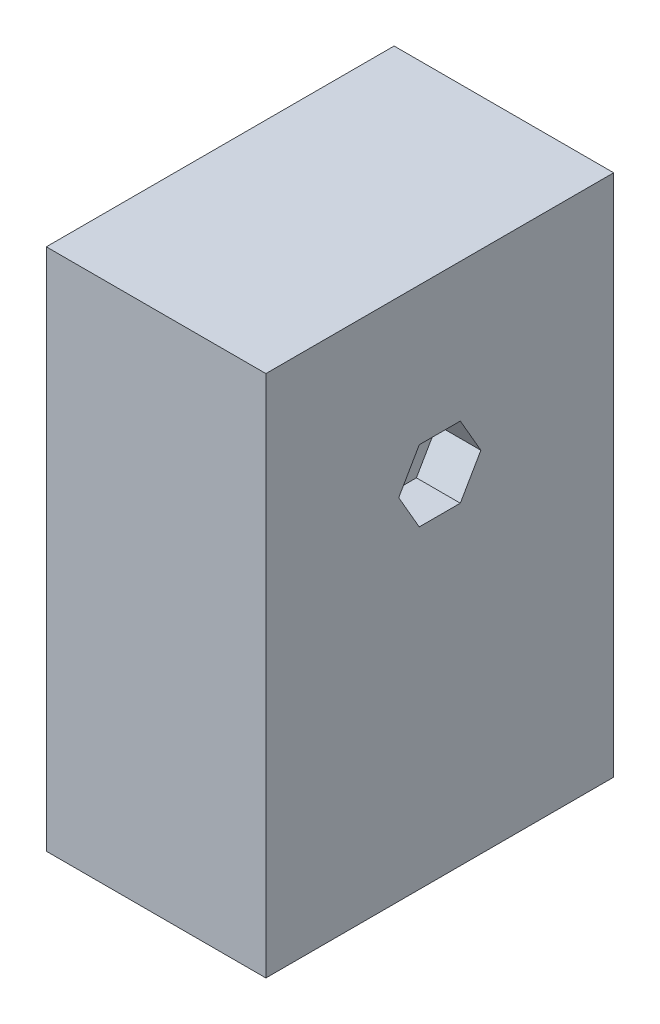
ISO-10303-21;
HEADER;
FILE_DESCRIPTION(('STEP AP214'),'2;1');
FILE_NAME('part.step','',(''),(''),'','','');
FILE_SCHEMA(('AUTOMOTIVE_DESIGN { 1 0 10303 214 1 1 1 1 }'));
ENDSEC;
DATA;
#1=APPLICATION_CONTEXT('core data for automotive mechanical design processes');
#2=APPLICATION_PROTOCOL_DEFINITION('international standard','automotive_design',2000,#1);
#3=PRODUCT_CONTEXT('',#1,'mechanical');
#4=PRODUCT('Part','Part','',(#3));
#5=PRODUCT_RELATED_PRODUCT_CATEGORY('part','',(#4));
#6=PRODUCT_DEFINITION_FORMATION('','',#4);
#7=PRODUCT_DEFINITION_CONTEXT('part definition',#1,'design');
#8=PRODUCT_DEFINITION('design','',#6,#7);
#9=PRODUCT_DEFINITION_SHAPE('','',#8);
#10=(LENGTH_UNIT() NAMED_UNIT(*) SI_UNIT(.MILLI.,.METRE.));
#11=(NAMED_UNIT(*) PLANE_ANGLE_UNIT() SI_UNIT($,.RADIAN.));
#12=(NAMED_UNIT(*) SI_UNIT($,.STERADIAN.) SOLID_ANGLE_UNIT());
#13=UNCERTAINTY_MEASURE_WITH_UNIT(LENGTH_MEASURE(1.E-05),#10,'distance_accuracy_value','');
#14=(GEOMETRIC_REPRESENTATION_CONTEXT(3) GLOBAL_UNCERTAINTY_ASSIGNED_CONTEXT((#13)) GLOBAL_UNIT_ASSIGNED_CONTEXT((#10,
#11,#12)) REPRESENTATION_CONTEXT('',''));
#15=CARTESIAN_POINT('',(0.,0.,0.));
#16=DIRECTION('',(0.,0.,1.));
#17=DIRECTION('',(1.,0.,0.));
#18=AXIS2_PLACEMENT_3D('',#15,#16,#17);
#19=CARTESIAN_POINT('',(25.,0.,0.));
#20=DIRECTION('',(1.,0.,0.));
#21=DIRECTION('',(0.,0.,-1.));
#22=AXIS2_PLACEMENT_3D('',#19,#20,#21);
#23=PLANE('',#22);
#24=DIRECTION('',(0.,1.,0.));
#25=VECTOR('',#24,1.);
#26=CARTESIAN_POINT('',(25.,29.8,-19.8));
#27=LINE('',#26,#25);
#28=CARTESIAN_POINT('',(25.,-29.8,-19.8));
#29=VERTEX_POINT('',#28);
#30=CARTESIAN_POINT('',(25.,29.8,-19.8));
#31=VERTEX_POINT('',#30);
#32=EDGE_CURVE('E252',#29,#31,#27,.T.);
#33=ORIENTED_EDGE('',*,*,#32,.T.);
#34=DIRECTION('',(0.,0.,1.));
#35=VECTOR('',#34,1.);
#36=CARTESIAN_POINT('',(25.,29.8,19.8));
#37=LINE('',#36,#35);
#38=CARTESIAN_POINT('',(25.,29.8,19.8));
#39=VERTEX_POINT('',#38);
#40=EDGE_CURVE('E256',#31,#39,#37,.T.);
#41=ORIENTED_EDGE('',*,*,#40,.T.);
#42=DIRECTION('',(0.,-1.,0.));
#43=VECTOR('',#42,1.);
#44=CARTESIAN_POINT('',(25.,29.8,19.8));
#45=LINE('',#44,#43);
#46=CARTESIAN_POINT('',(25.,-29.8,19.8));
#47=VERTEX_POINT('',#46);
#48=EDGE_CURVE('E260',#39,#47,#45,.T.);
#49=ORIENTED_EDGE('',*,*,#48,.T.);
#50=DIRECTION('',(0.,0.,-1.));
#51=VECTOR('',#50,1.);
#52=CARTESIAN_POINT('',(25.,-29.8,19.8));
#53=LINE('',#52,#51);
#54=EDGE_CURVE('E263',#47,#29,#53,.T.);
#55=ORIENTED_EDGE('',*,*,#54,.T.);
#56=EDGE_LOOP('',(#33,#41,#49,#55));
#57=FACE_BOUND('',#56,.T.);
#58=DIRECTION('',(0.,0.,1.));
#59=VECTOR('',#58,1.);
#60=CARTESIAN_POINT('',(25.,5.95,0.));
#61=LINE('',#60,#59);
#62=CARTESIAN_POINT('',(25.,5.95,-2.33826859021799));
#63=VERTEX_POINT('',#62);
#64=CARTESIAN_POINT('',(25.,5.95,2.33826859021799));
#65=VERTEX_POINT('',#64);
#66=EDGE_CURVE('E176',#63,#65,#61,.T.);
#67=ORIENTED_EDGE('',*,*,#66,.T.);
#68=DIRECTION('',(0.,0.866025403784439,0.5));
#69=VECTOR('',#68,1.);
#70=CARTESIAN_POINT('',(25.,0.474999999999998,-0.822724133595214));
#71=LINE('',#70,#69);
#72=CARTESIAN_POINT('',(25.,10.,4.67653718043597));
#73=VERTEX_POINT('',#72);
#74=EDGE_CURVE('E57',#65,#73,#71,.T.);
#75=ORIENTED_EDGE('',*,*,#74,.T.);
#76=DIRECTION('',(0.,0.866025403784439,-0.5));
#77=VECTOR('',#76,1.);
#78=CARTESIAN_POINT('',(25.,4.525,7.83752990424917));
#79=LINE('',#78,#77);
#80=CARTESIAN_POINT('',(25.,14.05,2.33826859021798));
#81=VERTEX_POINT('',#80);
#82=EDGE_CURVE('E180',#73,#81,#79,.T.);
#83=ORIENTED_EDGE('',*,*,#82,.T.);
#84=DIRECTION('',(0.,0.,-1.));
#85=VECTOR('',#84,1.);
#86=CARTESIAN_POINT('',(25.,14.05,0.));
#87=LINE('',#86,#85);
#88=CARTESIAN_POINT('',(25.,14.05,-2.33826859021799));
#89=VERTEX_POINT('',#88);
#90=EDGE_CURVE('E530',#81,#89,#87,.T.);
#91=ORIENTED_EDGE('',*,*,#90,.T.);
#92=DIRECTION('',(0.,-0.866025403784439,-0.5));
#93=VECTOR('',#92,1.);
#94=CARTESIAN_POINT('',(25.,4.525,-7.83752990424917));
#95=LINE('',#94,#93);
#96=CARTESIAN_POINT('',(25.,10.,-4.67653718043598));
#97=VERTEX_POINT('',#96);
#98=EDGE_CURVE('E525',#89,#97,#95,.T.);
#99=ORIENTED_EDGE('',*,*,#98,.T.);
#100=DIRECTION('',(0.,-0.866025403784439,0.5));
#101=VECTOR('',#100,1.);
#102=CARTESIAN_POINT('',(25.,0.475,0.822724133595216));
#103=LINE('',#102,#101);
#104=EDGE_CURVE('E519',#97,#63,#103,.T.);
#105=ORIENTED_EDGE('',*,*,#104,.T.);
#106=EDGE_LOOP('',(#67,#75,#83,#91,#99,#105));
#107=FACE_BOUND('',#106,.T.);
#108=ADVANCED_FACE('F39',(#57,#107),#23,.T.);
#109=CARTESIAN_POINT('',(0.,0.,0.));
#110=DIRECTION('',(1.,0.,0.));
#111=DIRECTION('',(0.,0.,-1.));
#112=AXIS2_PLACEMENT_3D('',#109,#110,#111);
#113=PLANE('',#112);
#114=DIRECTION('',(0.,1.,0.));
#115=VECTOR('',#114,1.);
#116=CARTESIAN_POINT('',(0.,29.8,-19.8));
#117=LINE('',#116,#115);
#118=CARTESIAN_POINT('',(0.,-29.8,-19.8));
#119=VERTEX_POINT('',#118);
#120=CARTESIAN_POINT('',(0.,29.8,-19.8));
#121=VERTEX_POINT('',#120);
#122=EDGE_CURVE('E251',#119,#121,#117,.T.);
#123=ORIENTED_EDGE('',*,*,#122,.F.);
#124=DIRECTION('',(0.,0.,-1.));
#125=VECTOR('',#124,1.);
#126=CARTESIAN_POINT('',(0.,-29.8,19.8));
#127=LINE('',#126,#125);
#128=CARTESIAN_POINT('',(0.,-29.8,19.8));
#129=VERTEX_POINT('',#128);
#130=EDGE_CURVE('E257',#129,#119,#127,.T.);
#131=ORIENTED_EDGE('',*,*,#130,.F.);
#132=DIRECTION('',(0.,-1.,0.));
#133=VECTOR('',#132,1.);
#134=CARTESIAN_POINT('',(0.,29.8,19.8));
#135=LINE('',#134,#133);
#136=CARTESIAN_POINT('',(0.,29.8,19.8));
#137=VERTEX_POINT('',#136);
#138=EDGE_CURVE('E273',#137,#129,#135,.T.);
#139=ORIENTED_EDGE('',*,*,#138,.F.);
#140=DIRECTION('',(0.,0.,1.));
#141=VECTOR('',#140,1.);
#142=CARTESIAN_POINT('',(0.,29.8,19.8));
#143=LINE('',#142,#141);
#144=EDGE_CURVE('E270',#121,#137,#143,.T.);
#145=ORIENTED_EDGE('',*,*,#144,.F.);
#146=EDGE_LOOP('',(#123,#131,#139,#145));
#147=FACE_BOUND('',#146,.T.);
#148=DIRECTION('',(0.,0.866025403784438,-0.5));
#149=VECTOR('',#148,1.);
#150=CARTESIAN_POINT('',(0.,5.95,-2.33826859021799));
#151=LINE('',#150,#149);
#152=CARTESIAN_POINT('',(0.,5.95,-2.33826859021799));
#153=VERTEX_POINT('',#152);
#154=CARTESIAN_POINT('',(0.,10.,-4.67653718043597));
#155=VERTEX_POINT('',#154);
#156=EDGE_CURVE('E65',#153,#155,#151,.T.);
#157=ORIENTED_EDGE('',*,*,#156,.T.);
#158=DIRECTION('',(0.,0.866025403784439,0.5));
#159=VECTOR('',#158,1.);
#160=CARTESIAN_POINT('',(0.,10.,-4.67653718043597));
#161=LINE('',#160,#159);
#162=CARTESIAN_POINT('',(0.,14.05,-2.33826859021799));
#163=VERTEX_POINT('',#162);
#164=EDGE_CURVE('E215',#155,#163,#161,.T.);
#165=ORIENTED_EDGE('',*,*,#164,.T.);
#166=DIRECTION('',(0.,0.,1.));
#167=VECTOR('',#166,1.);
#168=CARTESIAN_POINT('',(0.,14.05,-2.33826859021799));
#169=LINE('',#168,#167);
#170=CARTESIAN_POINT('',(0.,14.05,2.33826859021798));
#171=VERTEX_POINT('',#170);
#172=EDGE_CURVE('E219',#163,#171,#169,.T.);
#173=ORIENTED_EDGE('',*,*,#172,.T.);
#174=DIRECTION('',(0.,-0.866025403784439,0.5));
#175=VECTOR('',#174,1.);
#176=CARTESIAN_POINT('',(0.,14.05,2.33826859021798));
#177=LINE('',#176,#175);
#178=CARTESIAN_POINT('',(0.,10.,4.67653718043597));
#179=VERTEX_POINT('',#178);
#180=EDGE_CURVE('E223',#171,#179,#177,.T.);
#181=ORIENTED_EDGE('',*,*,#180,.T.);
#182=DIRECTION('',(0.,-0.866025403784439,-0.5));
#183=VECTOR('',#182,1.);
#184=CARTESIAN_POINT('',(0.,10.,4.67653718043597));
#185=LINE('',#184,#183);
#186=CARTESIAN_POINT('',(0.,5.95,2.33826859021799));
#187=VERTEX_POINT('',#186);
#188=EDGE_CURVE('E227',#179,#187,#185,.T.);
#189=ORIENTED_EDGE('',*,*,#188,.T.);
#190=DIRECTION('',(0.,0.,-1.));
#191=VECTOR('',#190,1.);
#192=CARTESIAN_POINT('',(0.,5.95,2.33826859021799));
#193=LINE('',#192,#191);
#194=EDGE_CURVE('E197',#187,#153,#193,.T.);
#195=ORIENTED_EDGE('',*,*,#194,.T.);
#196=EDGE_LOOP('',(#157,#165,#173,#181,#189,#195));
#197=FACE_BOUND('',#196,.T.);
#198=ADVANCED_FACE('F307',(#147,#197),#113,.F.);
#199=CARTESIAN_POINT('',(25.,29.8,-19.8));
#200=DIRECTION('',(0.,0.,1.));
#201=DIRECTION('',(0.,-1.,0.));
#202=AXIS2_PLACEMENT_3D('',#199,#200,#201);
#203=PLANE('',#202);
#204=ORIENTED_EDGE('',*,*,#122,.T.);
#205=DIRECTION('',(-1.,0.,0.));
#206=VECTOR('',#205,1.);
#207=CARTESIAN_POINT('',(25.,29.8,-19.8));
#208=LINE('',#207,#206);
#209=EDGE_CURVE('E11',#31,#121,#208,.T.);
#210=ORIENTED_EDGE('',*,*,#209,.F.);
#211=ORIENTED_EDGE('',*,*,#32,.F.);
#212=DIRECTION('',(-1.,0.,0.));
#213=VECTOR('',#212,1.);
#214=CARTESIAN_POINT('',(25.,-29.8,-19.8));
#215=LINE('',#214,#213);
#216=EDGE_CURVE('E266',#29,#119,#215,.T.);
#217=ORIENTED_EDGE('',*,*,#216,.T.);
#218=EDGE_LOOP('',(#204,#210,#211,#217));
#219=FACE_BOUND('',#218,.T.);
#220=ADVANCED_FACE('F41',(#219),#203,.F.);
#221=CARTESIAN_POINT('',(25.,29.8,19.8));
#222=DIRECTION('',(0.,-1.,0.));
#223=DIRECTION('',(0.,0.,-1.));
#224=AXIS2_PLACEMENT_3D('',#221,#222,#223);
#225=PLANE('',#224);
#226=ORIENTED_EDGE('',*,*,#144,.T.);
#227=DIRECTION('',(-1.,0.,0.));
#228=VECTOR('',#227,1.);
#229=CARTESIAN_POINT('',(25.,29.8,19.8));
#230=LINE('',#229,#228);
#231=EDGE_CURVE('E49',#39,#137,#230,.T.);
#232=ORIENTED_EDGE('',*,*,#231,.F.);
#233=ORIENTED_EDGE('',*,*,#40,.F.);
#234=ORIENTED_EDGE('',*,*,#209,.T.);
#235=EDGE_LOOP('',(#226,#232,#233,#234));
#236=FACE_BOUND('',#235,.T.);
#237=ADVANCED_FACE('F326',(#236),#225,.F.);
#238=CARTESIAN_POINT('',(25.,29.8,19.8));
#239=DIRECTION('',(0.,0.,-1.));
#240=DIRECTION('',(0.,1.,0.));
#241=AXIS2_PLACEMENT_3D('',#238,#239,#240);
#242=PLANE('',#241);
#243=ORIENTED_EDGE('',*,*,#138,.T.);
#244=DIRECTION('',(-1.,0.,0.));
#245=VECTOR('',#244,1.);
#246=CARTESIAN_POINT('',(25.,-29.8,19.8));
#247=LINE('',#246,#245);
#248=EDGE_CURVE('E281',#47,#129,#247,.T.);
#249=ORIENTED_EDGE('',*,*,#248,.F.);
#250=ORIENTED_EDGE('',*,*,#48,.F.);
#251=ORIENTED_EDGE('',*,*,#231,.T.);
#252=EDGE_LOOP('',(#243,#249,#250,#251));
#253=FACE_BOUND('',#252,.T.);
#254=ADVANCED_FACE('F323',(#253),#242,.F.);
#255=CARTESIAN_POINT('',(25.,-29.8,19.8));
#256=DIRECTION('',(0.,1.,0.));
#257=DIRECTION('',(0.,0.,1.));
#258=AXIS2_PLACEMENT_3D('',#255,#256,#257);
#259=PLANE('',#258);
#260=ORIENTED_EDGE('',*,*,#130,.T.);
#261=ORIENTED_EDGE('',*,*,#216,.F.);
#262=ORIENTED_EDGE('',*,*,#54,.F.);
#263=ORIENTED_EDGE('',*,*,#248,.T.);
#264=EDGE_LOOP('',(#260,#261,#262,#263));
#265=FACE_BOUND('',#264,.T.);
#266=ADVANCED_FACE('F320',(#265),#259,.F.);
#267=CARTESIAN_POINT('',(5.,5.95,-2.33826859021799));
#268=DIRECTION('',(0.,0.5,0.866025403784439));
#269=DIRECTION('',(0.,-0.866025403784439,0.5));
#270=AXIS2_PLACEMENT_3D('',#267,#268,#269);
#271=PLANE('',#270);
#272=ORIENTED_EDGE('',*,*,#156,.F.);
#273=DIRECTION('',(-1.,0.,0.));
#274=VECTOR('',#273,1.);
#275=CARTESIAN_POINT('',(5.,5.95,-2.33826859021799));
#276=LINE('',#275,#274);
#277=CARTESIAN_POINT('',(5.,5.95,-2.33826859021799));
#278=VERTEX_POINT('',#277);
#279=EDGE_CURVE('E212',#278,#153,#276,.T.);
#280=ORIENTED_EDGE('',*,*,#279,.F.);
#281=DIRECTION('',(0.,0.866025403784438,-0.5));
#282=VECTOR('',#281,1.);
#283=CARTESIAN_POINT('',(5.,5.95,-2.33826859021799));
#284=LINE('',#283,#282);
#285=CARTESIAN_POINT('',(5.,10.,-4.67653718043597));
#286=VERTEX_POINT('',#285);
#287=EDGE_CURVE('E192',#278,#286,#284,.T.);
#288=ORIENTED_EDGE('',*,*,#287,.T.);
#289=DIRECTION('',(-1.,0.,0.));
#290=VECTOR('',#289,1.);
#291=CARTESIAN_POINT('',(5.,10.,-4.67653718043597));
#292=LINE('',#291,#290);
#293=EDGE_CURVE('E248',#286,#155,#292,.T.);
#294=ORIENTED_EDGE('',*,*,#293,.T.);
#295=EDGE_LOOP('',(#272,#280,#288,#294));
#296=FACE_BOUND('',#295,.T.);
#297=ADVANCED_FACE('F317',(#296),#271,.T.);
#298=CARTESIAN_POINT('',(5.,10.,-4.67653718043597));
#299=DIRECTION('',(0.,-0.5,0.866025403784439));
#300=DIRECTION('',(0.,-0.866025403784439,-0.5));
#301=AXIS2_PLACEMENT_3D('',#298,#299,#300);
#302=PLANE('',#301);
#303=ORIENTED_EDGE('',*,*,#164,.F.);
#304=ORIENTED_EDGE('',*,*,#293,.F.);
#305=DIRECTION('',(0.,0.866025403784439,0.5));
#306=VECTOR('',#305,1.);
#307=CARTESIAN_POINT('',(5.,10.,-4.67653718043597));
#308=LINE('',#307,#306);
#309=CARTESIAN_POINT('',(5.,14.05,-2.33826859021799));
#310=VERTEX_POINT('',#309);
#311=EDGE_CURVE('E196',#286,#310,#308,.T.);
#312=ORIENTED_EDGE('',*,*,#311,.T.);
#313=DIRECTION('',(-1.,0.,0.));
#314=VECTOR('',#313,1.);
#315=CARTESIAN_POINT('',(5.,14.05,-2.33826859021799));
#316=LINE('',#315,#314);
#317=EDGE_CURVE('E245',#310,#163,#316,.T.);
#318=ORIENTED_EDGE('',*,*,#317,.T.);
#319=EDGE_LOOP('',(#303,#304,#312,#318));
#320=FACE_BOUND('',#319,.T.);
#321=ADVANCED_FACE('F357',(#320),#302,.T.);
#322=CARTESIAN_POINT('',(5.,14.05,-2.33826859021799));
#323=DIRECTION('',(0.,-1.,0.));
#324=DIRECTION('',(0.,0.,-1.));
#325=AXIS2_PLACEMENT_3D('',#322,#323,#324);
#326=PLANE('',#325);
#327=ORIENTED_EDGE('',*,*,#172,.F.);
#328=ORIENTED_EDGE('',*,*,#317,.F.);
#329=DIRECTION('',(0.,0.,1.));
#330=VECTOR('',#329,1.);
#331=CARTESIAN_POINT('',(5.,14.05,-2.33826859021799));
#332=LINE('',#331,#330);
#333=CARTESIAN_POINT('',(5.,14.05,2.33826859021798));
#334=VERTEX_POINT('',#333);
#335=EDGE_CURVE('E200',#310,#334,#332,.T.);
#336=ORIENTED_EDGE('',*,*,#335,.T.);
#337=DIRECTION('',(-1.,0.,0.));
#338=VECTOR('',#337,1.);
#339=CARTESIAN_POINT('',(5.,14.05,2.33826859021798));
#340=LINE('',#339,#338);
#341=EDGE_CURVE('E242',#334,#171,#340,.T.);
#342=ORIENTED_EDGE('',*,*,#341,.T.);
#343=EDGE_LOOP('',(#327,#328,#336,#342));
#344=FACE_BOUND('',#343,.T.);
#345=ADVANCED_FACE('F360',(#344),#326,.T.);
#346=CARTESIAN_POINT('',(5.,14.05,2.33826859021798));
#347=DIRECTION('',(0.,-0.5,-0.866025403784439));
#348=DIRECTION('',(0.,0.866025403784439,-0.5));
#349=AXIS2_PLACEMENT_3D('',#346,#347,#348);
#350=PLANE('',#349);
#351=ORIENTED_EDGE('',*,*,#180,.F.);
#352=ORIENTED_EDGE('',*,*,#341,.F.);
#353=DIRECTION('',(0.,-0.866025403784439,0.5));
#354=VECTOR('',#353,1.);
#355=CARTESIAN_POINT('',(5.,14.05,2.33826859021798));
#356=LINE('',#355,#354);
#357=CARTESIAN_POINT('',(5.,10.,4.67653718043597));
#358=VERTEX_POINT('',#357);
#359=EDGE_CURVE('E203',#334,#358,#356,.T.);
#360=ORIENTED_EDGE('',*,*,#359,.T.);
#361=DIRECTION('',(-1.,0.,0.));
#362=VECTOR('',#361,1.);
#363=CARTESIAN_POINT('',(5.,10.,4.67653718043597));
#364=LINE('',#363,#362);
#365=EDGE_CURVE('E239',#358,#179,#364,.T.);
#366=ORIENTED_EDGE('',*,*,#365,.T.);
#367=EDGE_LOOP('',(#351,#352,#360,#366));
#368=FACE_BOUND('',#367,.T.);
#369=ADVANCED_FACE('F364',(#368),#350,.T.);
#370=CARTESIAN_POINT('',(5.,10.,4.67653718043597));
#371=DIRECTION('',(0.,0.5,-0.866025403784439));
#372=DIRECTION('',(0.,0.866025403784439,0.5));
#373=AXIS2_PLACEMENT_3D('',#370,#371,#372);
#374=PLANE('',#373);
#375=ORIENTED_EDGE('',*,*,#188,.F.);
#376=ORIENTED_EDGE('',*,*,#365,.F.);
#377=DIRECTION('',(0.,-0.866025403784439,-0.5));
#378=VECTOR('',#377,1.);
#379=CARTESIAN_POINT('',(5.,10.,4.67653718043597));
#380=LINE('',#379,#378);
#381=CARTESIAN_POINT('',(5.,5.95,2.33826859021799));
#382=VERTEX_POINT('',#381);
#383=EDGE_CURVE('E206',#358,#382,#380,.T.);
#384=ORIENTED_EDGE('',*,*,#383,.T.);
#385=DIRECTION('',(-1.,0.,0.));
#386=VECTOR('',#385,1.);
#387=CARTESIAN_POINT('',(5.,5.95,2.33826859021799));
#388=LINE('',#387,#386);
#389=EDGE_CURVE('E236',#382,#187,#388,.T.);
#390=ORIENTED_EDGE('',*,*,#389,.T.);
#391=EDGE_LOOP('',(#375,#376,#384,#390));
#392=FACE_BOUND('',#391,.T.);
#393=ADVANCED_FACE('F367',(#392),#374,.T.);
#394=CARTESIAN_POINT('',(5.,5.95,2.33826859021799));
#395=DIRECTION('',(0.,1.,0.));
#396=DIRECTION('',(0.,0.,1.));
#397=AXIS2_PLACEMENT_3D('',#394,#395,#396);
#398=PLANE('',#397);
#399=ORIENTED_EDGE('',*,*,#194,.F.);
#400=ORIENTED_EDGE('',*,*,#389,.F.);
#401=DIRECTION('',(0.,0.,-1.));
#402=VECTOR('',#401,1.);
#403=CARTESIAN_POINT('',(5.,5.95,2.33826859021799));
#404=LINE('',#403,#402);
#405=EDGE_CURVE('E209',#382,#278,#404,.T.);
#406=ORIENTED_EDGE('',*,*,#405,.T.);
#407=ORIENTED_EDGE('',*,*,#279,.T.);
#408=EDGE_LOOP('',(#399,#400,#406,#407));
#409=FACE_BOUND('',#408,.T.);
#410=ADVANCED_FACE('F303',(#409),#398,.T.);
#411=CARTESIAN_POINT('',(5.,0.,0.));
#412=DIRECTION('',(1.,0.,0.));
#413=DIRECTION('',(0.,0.,-1.));
#414=AXIS2_PLACEMENT_3D('',#411,#412,#413);
#415=PLANE('',#414);
#416=CARTESIAN_POINT('',(5.,10.,0.));
#417=DIRECTION('',(1.,0.,0.));
#418=DIRECTION('',(0.,0.,-1.));
#419=AXIS2_PLACEMENT_3D('',#416,#417,#418);
#420=CIRCLE('',#419,2.75);
#421=CARTESIAN_POINT('',(5.,10.,-2.75));
#422=VERTEX_POINT('',#421);
#423=EDGE_CURVE('E187',#422,#422,#420,.T.);
#424=ORIENTED_EDGE('',*,*,#423,.T.);
#425=EDGE_LOOP('',(#424));
#426=FACE_BOUND('',#425,.T.);
#427=ORIENTED_EDGE('',*,*,#287,.F.);
#428=ORIENTED_EDGE('',*,*,#405,.F.);
#429=ORIENTED_EDGE('',*,*,#383,.F.);
#430=ORIENTED_EDGE('',*,*,#359,.F.);
#431=ORIENTED_EDGE('',*,*,#335,.F.);
#432=ORIENTED_EDGE('',*,*,#311,.F.);
#433=EDGE_LOOP('',(#427,#428,#429,#430,#431,#432));
#434=FACE_BOUND('',#433,.T.);
#435=ADVANCED_FACE('F291',(#426,#434),#415,.F.);
#436=CARTESIAN_POINT('',(-1.2E-05,10.,0.));
#437=DIRECTION('',(1.,0.,0.));
#438=DIRECTION('',(0.,0.,-1.));
#439=AXIS2_PLACEMENT_3D('',#436,#437,#438);
#440=CYLINDRICAL_SURFACE('',#439,2.75);
#441=CARTESIAN_POINT('',(20.,10.,0.));
#442=DIRECTION('',(-1.,0.,0.));
#443=DIRECTION('',(0.,0.,1.));
#444=AXIS2_PLACEMENT_3D('',#441,#442,#443);
#445=CIRCLE('',#444,2.75);
#446=CARTESIAN_POINT('',(20.,10.,-2.75));
#447=VERTEX_POINT('',#446);
#448=EDGE_CURVE('E43',#447,#447,#445,.F.);
#449=CARTESIAN_POINT('',(20.,10.,-2.75));
#450=CARTESIAN_POINT('',(19.84375,10.,-2.75));
#451=CARTESIAN_POINT('',(19.6875,10.,-2.75));
#452=CARTESIAN_POINT('',(19.375,10.,-2.75));
#453=CARTESIAN_POINT('',(19.21875,10.,-2.75));
#454=CARTESIAN_POINT('',(18.90625,10.,-2.75));
#455=CARTESIAN_POINT('',(18.75,10.,-2.75));
#456=CARTESIAN_POINT('',(18.4375,10.,-2.75));
#457=CARTESIAN_POINT('',(18.28125,10.,-2.75));
#458=CARTESIAN_POINT('',(17.96875,10.,-2.75));
#459=CARTESIAN_POINT('',(17.8125,10.,-2.75));
#460=CARTESIAN_POINT('',(17.5,10.,-2.75));
#461=CARTESIAN_POINT('',(17.34375,10.,-2.75));
#462=CARTESIAN_POINT('',(17.03125,10.,-2.75));
#463=CARTESIAN_POINT('',(16.875,10.,-2.75));
#464=CARTESIAN_POINT('',(16.5625,10.,-2.75));
#465=CARTESIAN_POINT('',(16.40625,10.,-2.75));
#466=CARTESIAN_POINT('',(16.09375,10.,-2.75));
#467=CARTESIAN_POINT('',(15.9375,10.,-2.75));
#468=CARTESIAN_POINT('',(15.625,10.,-2.75));
#469=CARTESIAN_POINT('',(15.46875,10.,-2.75));
#470=CARTESIAN_POINT('',(15.15625,10.,-2.75));
#471=CARTESIAN_POINT('',(15.,10.,-2.75));
#472=CARTESIAN_POINT('',(14.6875,10.,-2.75));
#473=CARTESIAN_POINT('',(14.53125,10.,-2.75));
#474=CARTESIAN_POINT('',(14.21875,10.,-2.75));
#475=CARTESIAN_POINT('',(14.0625,10.,-2.75));
#476=CARTESIAN_POINT('',(13.75,10.,-2.75));
#477=CARTESIAN_POINT('',(13.59375,10.,-2.75));
#478=CARTESIAN_POINT('',(13.28125,10.,-2.75));
#479=CARTESIAN_POINT('',(13.125,10.,-2.75));
#480=CARTESIAN_POINT('',(12.8125,10.,-2.75));
#481=CARTESIAN_POINT('',(12.65625,10.,-2.75));
#482=CARTESIAN_POINT('',(12.34375,10.,-2.75));
#483=CARTESIAN_POINT('',(12.1875,10.,-2.75));
#484=CARTESIAN_POINT('',(11.875,10.,-2.75));
#485=CARTESIAN_POINT('',(11.71875,10.,-2.75));
#486=CARTESIAN_POINT('',(11.40625,10.,-2.75));
#487=CARTESIAN_POINT('',(11.25,10.,-2.75));
#488=CARTESIAN_POINT('',(10.9375,10.,-2.75));
#489=CARTESIAN_POINT('',(10.78125,10.,-2.75));
#490=CARTESIAN_POINT('',(10.46875,10.,-2.75));
#491=CARTESIAN_POINT('',(10.3125,10.,-2.75));
#492=CARTESIAN_POINT('',(10.,10.,-2.75));
#493=CARTESIAN_POINT('',(9.84375,10.,-2.75));
#494=CARTESIAN_POINT('',(9.53125,10.,-2.75));
#495=CARTESIAN_POINT('',(9.375,10.,-2.75));
#496=CARTESIAN_POINT('',(9.0625,10.,-2.75));
#497=CARTESIAN_POINT('',(8.90625,10.,-2.75));
#498=CARTESIAN_POINT('',(8.59375,10.,-2.75));
#499=CARTESIAN_POINT('',(8.4375,10.,-2.75));
#500=CARTESIAN_POINT('',(8.125,10.,-2.75));
#501=CARTESIAN_POINT('',(7.96875,10.,-2.75));
#502=CARTESIAN_POINT('',(7.65625,10.,-2.75));
#503=CARTESIAN_POINT('',(7.5,10.,-2.75));
#504=CARTESIAN_POINT('',(7.1875,10.,-2.75));
#505=CARTESIAN_POINT('',(7.03125,10.,-2.75));
#506=CARTESIAN_POINT('',(6.71875,10.,-2.75));
#507=CARTESIAN_POINT('',(6.5625,10.,-2.75));
#508=CARTESIAN_POINT('',(6.25,10.,-2.75));
#509=CARTESIAN_POINT('',(6.09375,10.,-2.75));
#510=CARTESIAN_POINT('',(5.78125,10.,-2.75));
#511=CARTESIAN_POINT('',(5.625,10.,-2.75));
#512=CARTESIAN_POINT('',(5.3125,10.,-2.75));
#513=CARTESIAN_POINT('',(5.15625,10.,-2.75));
#514=CARTESIAN_POINT('',(5.,10.,-2.75));
#515=B_SPLINE_CURVE_WITH_KNOTS('',3,(#449,#450,#451,#452,#453,#454,#455,#456,#457,#458,#459,
#460,#461,#462,#463,#464,#465,#466,#467,#468,#469,#470,#471,#472,#473,#474,#475,#476,#477,#478,
#479,#480,#481,#482,#483,#484,#485,#486,#487,#488,#489,#490,#491,#492,#493,#494,#495,#496,#497,
#498,#499,#500,#501,#502,#503,#504,#505,#506,#507,#508,#509,#510,#511,#512,#513,#514),
.UNSPECIFIED.,.F.,.F.,(4,2,2,2,2,2,2,2,2,2,2,2,2,2,2,2,2,2,2,2,2,2,2,2,2,2,2,2,2,2,2,2,4),(0.,
0.46875,0.937500000000001,1.40625,1.875,2.34375,2.8125,3.28125,3.75,4.21875,4.6875,5.15625,
5.625,6.09375,6.5625,7.03125,7.5,7.96875,8.4375,8.90625,9.375,9.84375,10.3125,10.78125,11.25,
11.71875,12.1875,12.65625,13.125,13.59375,14.0625,14.53125,15.),.UNSPECIFIED.);
#516=EDGE_CURVE('BSEAM294',#447,#422,#515,.T.);
#517=ORIENTED_EDGE('',*,*,#448,.T.);
#518=ORIENTED_EDGE('',*,*,#423,.F.);
#519=ORIENTED_EDGE('',*,*,#516,.T.);
#520=ORIENTED_EDGE('',*,*,#516,.F.);
#521=EDGE_LOOP('',(#517,#519,#518,#520));
#522=FACE_BOUND('',#521,.T.);
#523=ADVANCED_FACE('F294',(#522),#440,.F.);
#524=CARTESIAN_POINT('',(20.,0.,0.));
#525=DIRECTION('',(-1.,0.,0.));
#526=DIRECTION('',(0.,0.,1.));
#527=AXIS2_PLACEMENT_3D('',#524,#525,#526);
#528=PLANE('',#527);
#529=DIRECTION('',(0.,0.866025403784439,0.5));
#530=VECTOR('',#529,1.);
#531=CARTESIAN_POINT('',(20.,0.474999999999998,-0.822724133595214));
#532=LINE('',#531,#530);
#533=CARTESIAN_POINT('',(20.,5.95,2.33826859021799));
#534=VERTEX_POINT('',#533);
#535=CARTESIAN_POINT('',(20.,10.,4.67653718043597));
#536=VERTEX_POINT('',#535);
#537=EDGE_CURVE('E164',#534,#536,#532,.T.);
#538=ORIENTED_EDGE('',*,*,#537,.F.);
#539=DIRECTION('',(0.,0.,1.));
#540=VECTOR('',#539,1.);
#541=CARTESIAN_POINT('',(20.,5.95,0.));
#542=LINE('',#541,#540);
#543=CARTESIAN_POINT('',(20.,5.95,-2.33826859021799));
#544=VERTEX_POINT('',#543);
#545=EDGE_CURVE('E536',#544,#534,#542,.T.);
#546=ORIENTED_EDGE('',*,*,#545,.F.);
#547=DIRECTION('',(0.,-0.866025403784439,0.5));
#548=VECTOR('',#547,1.);
#549=CARTESIAN_POINT('',(20.,0.475,0.822724133595216));
#550=LINE('',#549,#548);
#551=CARTESIAN_POINT('',(20.,10.,-4.67653718043598));
#552=VERTEX_POINT('',#551);
#553=EDGE_CURVE('E552',#552,#544,#550,.T.);
#554=ORIENTED_EDGE('',*,*,#553,.F.);
#555=DIRECTION('',(0.,-0.866025403784439,-0.5));
#556=VECTOR('',#555,1.);
#557=CARTESIAN_POINT('',(20.,4.525,-7.83752990424917));
#558=LINE('',#557,#556);
#559=CARTESIAN_POINT('',(20.,14.05,-2.33826859021799));
#560=VERTEX_POINT('',#559);
#561=EDGE_CURVE('E555',#560,#552,#558,.T.);
#562=ORIENTED_EDGE('',*,*,#561,.F.);
#563=DIRECTION('',(0.,0.,-1.));
#564=VECTOR('',#563,1.);
#565=CARTESIAN_POINT('',(20.,14.05,0.));
#566=LINE('',#565,#564);
#567=CARTESIAN_POINT('',(20.,14.05,2.33826859021798));
#568=VERTEX_POINT('',#567);
#569=EDGE_CURVE('E166',#568,#560,#566,.T.);
#570=ORIENTED_EDGE('',*,*,#569,.F.);
#571=DIRECTION('',(0.,0.866025403784439,-0.5));
#572=VECTOR('',#571,1.);
#573=CARTESIAN_POINT('',(20.,4.525,7.83752990424917));
#574=LINE('',#573,#572);
#575=EDGE_CURVE('E159',#536,#568,#574,.T.);
#576=ORIENTED_EDGE('',*,*,#575,.F.);
#577=EDGE_LOOP('',(#538,#546,#554,#562,#570,#576));
#578=FACE_BOUND('',#577,.T.);
#579=ORIENTED_EDGE('',*,*,#448,.F.);
#580=EDGE_LOOP('',(#579));
#581=FACE_BOUND('',#580,.T.);
#582=ADVANCED_FACE('F161',(#578,#581),#528,.F.);
#583=CARTESIAN_POINT('',(20.,0.474999999999998,-0.822724133595214));
#584=DIRECTION('',(0.,0.5,-0.866025403784439));
#585=DIRECTION('',(0.,0.866025403784439,0.5));
#586=AXIS2_PLACEMENT_3D('',#583,#584,#585);
#587=PLANE('',#586);
#588=ORIENTED_EDGE('',*,*,#74,.F.);
#589=DIRECTION('',(1.,0.,0.));
#590=VECTOR('',#589,1.);
#591=CARTESIAN_POINT('',(20.,5.95,2.33826859021799));
#592=LINE('',#591,#590);
#593=EDGE_CURVE('E174',#534,#65,#592,.T.);
#594=ORIENTED_EDGE('',*,*,#593,.F.);
#595=ORIENTED_EDGE('',*,*,#537,.T.);
#596=DIRECTION('',(1.,0.,0.));
#597=VECTOR('',#596,1.);
#598=CARTESIAN_POINT('',(20.,10.,4.67653718043597));
#599=LINE('',#598,#597);
#600=EDGE_CURVE('E173',#536,#73,#599,.T.);
#601=ORIENTED_EDGE('',*,*,#600,.T.);
#602=EDGE_LOOP('',(#588,#594,#595,#601));
#603=FACE_BOUND('',#602,.T.);
#604=ADVANCED_FACE('F172',(#603),#587,.T.);
#605=CARTESIAN_POINT('',(20.,4.525,7.83752990424917));
#606=DIRECTION('',(0.,-0.5,-0.866025403784439));
#607=DIRECTION('',(0.,0.866025403784439,-0.5));
#608=AXIS2_PLACEMENT_3D('',#605,#606,#607);
#609=PLANE('',#608);
#610=ORIENTED_EDGE('',*,*,#82,.F.);
#611=ORIENTED_EDGE('',*,*,#600,.F.);
#612=ORIENTED_EDGE('',*,*,#575,.T.);
#613=DIRECTION('',(1.,0.,0.));
#614=VECTOR('',#613,1.);
#615=CARTESIAN_POINT('',(20.,14.05,2.33826859021798));
#616=LINE('',#615,#614);
#617=EDGE_CURVE('E182',#568,#81,#616,.T.);
#618=ORIENTED_EDGE('',*,*,#617,.T.);
#619=EDGE_LOOP('',(#610,#611,#612,#618));
#620=FACE_BOUND('',#619,.T.);
#621=ADVANCED_FACE('F178',(#620),#609,.T.);
#622=CARTESIAN_POINT('',(20.,14.05,0.));
#623=DIRECTION('',(0.,-1.,0.));
#624=DIRECTION('',(0.,0.,-1.));
#625=AXIS2_PLACEMENT_3D('',#622,#623,#624);
#626=PLANE('',#625);
#627=ORIENTED_EDGE('',*,*,#90,.F.);
#628=ORIENTED_EDGE('',*,*,#617,.F.);
#629=ORIENTED_EDGE('',*,*,#569,.T.);
#630=DIRECTION('',(1.,0.,0.));
#631=VECTOR('',#630,1.);
#632=CARTESIAN_POINT('',(20.,14.05,-2.33826859021799));
#633=LINE('',#632,#631);
#634=EDGE_CURVE('E188',#560,#89,#633,.T.);
#635=ORIENTED_EDGE('',*,*,#634,.T.);
#636=EDGE_LOOP('',(#627,#628,#629,#635));
#637=FACE_BOUND('',#636,.T.);
#638=ADVANCED_FACE('F469',(#637),#626,.T.);
#639=CARTESIAN_POINT('',(20.,4.525,-7.83752990424917));
#640=DIRECTION('',(0.,-0.5,0.866025403784439));
#641=DIRECTION('',(0.,-0.866025403784439,-0.5));
#642=AXIS2_PLACEMENT_3D('',#639,#640,#641);
#643=PLANE('',#642);
#644=ORIENTED_EDGE('',*,*,#98,.F.);
#645=ORIENTED_EDGE('',*,*,#634,.F.);
#646=ORIENTED_EDGE('',*,*,#561,.T.);
#647=DIRECTION('',(1.,0.,0.));
#648=VECTOR('',#647,1.);
#649=CARTESIAN_POINT('',(20.,10.,-4.67653718043598));
#650=LINE('',#649,#648);
#651=EDGE_CURVE('E539',#552,#97,#650,.T.);
#652=ORIENTED_EDGE('',*,*,#651,.T.);
#653=EDGE_LOOP('',(#644,#645,#646,#652));
#654=FACE_BOUND('',#653,.T.);
#655=ADVANCED_FACE('F477',(#654),#643,.T.);
#656=CARTESIAN_POINT('',(20.,0.475,0.822724133595216));
#657=DIRECTION('',(0.,0.5,0.866025403784438));
#658=DIRECTION('',(0.,-0.866025403784439,0.5));
#659=AXIS2_PLACEMENT_3D('',#656,#657,#658);
#660=PLANE('',#659);
#661=ORIENTED_EDGE('',*,*,#104,.F.);
#662=ORIENTED_EDGE('',*,*,#651,.F.);
#663=ORIENTED_EDGE('',*,*,#553,.T.);
#664=DIRECTION('',(1.,0.,0.));
#665=VECTOR('',#664,1.);
#666=CARTESIAN_POINT('',(20.,5.95,-2.33826859021799));
#667=LINE('',#666,#665);
#668=EDGE_CURVE('E517',#544,#63,#667,.T.);
#669=ORIENTED_EDGE('',*,*,#668,.T.);
#670=EDGE_LOOP('',(#661,#662,#663,#669));
#671=FACE_BOUND('',#670,.T.);
#672=ADVANCED_FACE('F486',(#671),#660,.T.);
#673=CARTESIAN_POINT('',(20.,5.95,0.));
#674=DIRECTION('',(0.,1.,0.));
#675=DIRECTION('',(0.,0.,1.));
#676=AXIS2_PLACEMENT_3D('',#673,#674,#675);
#677=PLANE('',#676);
#678=ORIENTED_EDGE('',*,*,#66,.F.);
#679=ORIENTED_EDGE('',*,*,#668,.F.);
#680=ORIENTED_EDGE('',*,*,#545,.T.);
#681=ORIENTED_EDGE('',*,*,#593,.T.);
#682=EDGE_LOOP('',(#678,#679,#680,#681));
#683=FACE_BOUND('',#682,.T.);
#684=ADVANCED_FACE('F495',(#683),#677,.T.);
#685=CLOSED_SHELL('',(#108,#198,#220,#237,#254,#266,#297,#321,#345,#369,#393,#410,#435,#523,
#582,#604,#621,#638,#655,#672,#684));
#686=MANIFOLD_SOLID_BREP('B2',#685);
#687=ADVANCED_BREP_SHAPE_REPRESENTATION('',(#18,#686),#14);
#688=SHAPE_DEFINITION_REPRESENTATION(#9,#687);
ENDSEC;
END-ISO-10303-21;
